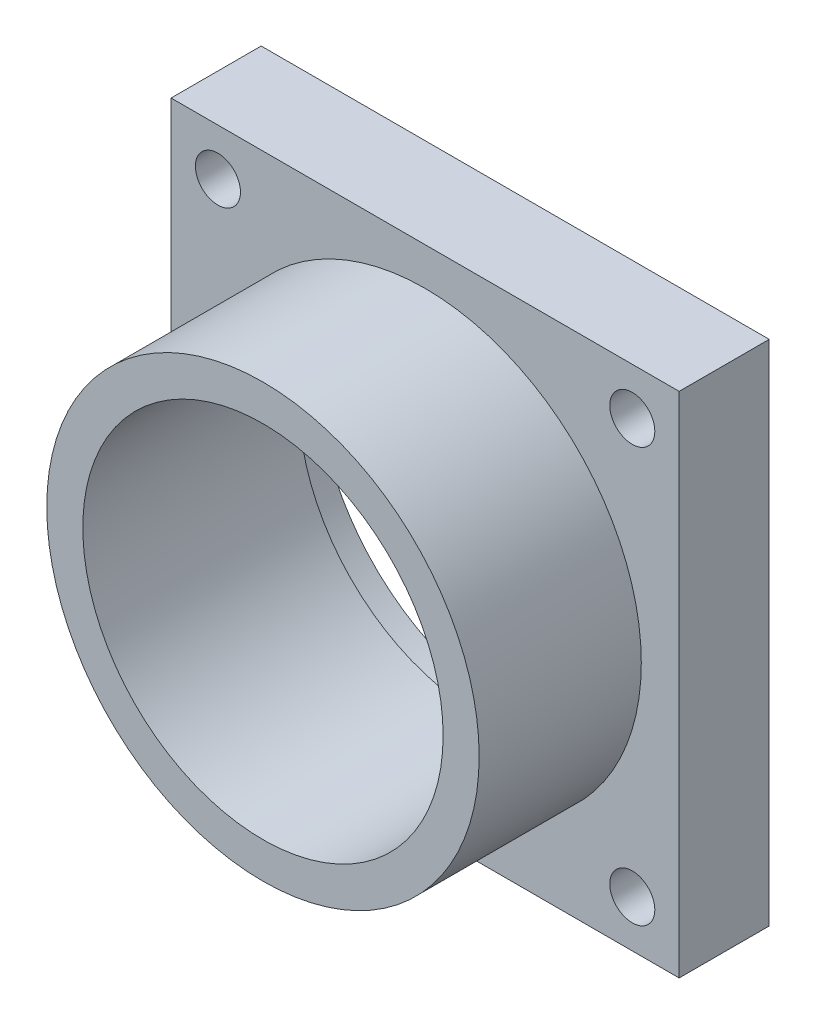
ISO-10303-21;
HEADER;
FILE_DESCRIPTION(('STEP AP214'),'2;1');
FILE_NAME('part.step','',(''),(''),'','','');
FILE_SCHEMA(('AUTOMOTIVE_DESIGN { 1 0 10303 214 1 1 1 1 }'));
ENDSEC;
DATA;
#1=APPLICATION_CONTEXT('core data for automotive mechanical design processes');
#2=APPLICATION_PROTOCOL_DEFINITION('international standard','automotive_design',2000,#1);
#3=PRODUCT_CONTEXT('',#1,'mechanical');
#4=PRODUCT('Part','Part','',(#3));
#5=PRODUCT_RELATED_PRODUCT_CATEGORY('part','',(#4));
#6=PRODUCT_DEFINITION_FORMATION('','',#4);
#7=PRODUCT_DEFINITION_CONTEXT('part definition',#1,'design');
#8=PRODUCT_DEFINITION('design','',#6,#7);
#9=PRODUCT_DEFINITION_SHAPE('','',#8);
#10=(LENGTH_UNIT() NAMED_UNIT(*) SI_UNIT(.MILLI.,.METRE.));
#11=(NAMED_UNIT(*) PLANE_ANGLE_UNIT() SI_UNIT($,.RADIAN.));
#12=(NAMED_UNIT(*) SI_UNIT($,.STERADIAN.) SOLID_ANGLE_UNIT());
#13=UNCERTAINTY_MEASURE_WITH_UNIT(LENGTH_MEASURE(1.E-05),#10,'distance_accuracy_value','');
#14=(GEOMETRIC_REPRESENTATION_CONTEXT(3) GLOBAL_UNCERTAINTY_ASSIGNED_CONTEXT((#13)) GLOBAL_UNIT_ASSIGNED_CONTEXT((#10,
#11,#12)) REPRESENTATION_CONTEXT('',''));
#15=CARTESIAN_POINT('',(0.,0.,0.));
#16=DIRECTION('',(0.,0.,1.));
#17=DIRECTION('',(1.,0.,0.));
#18=AXIS2_PLACEMENT_3D('',#15,#16,#17);
#19=CARTESIAN_POINT('',(14.1,0.,5.));
#20=DIRECTION('',(1.,0.,0.));
#21=DIRECTION('',(0.,0.,-1.));
#22=AXIS2_PLACEMENT_3D('',#19,#20,#21);
#23=PLANE('',#22);
#24=DIRECTION('',(0.,-1.,0.));
#25=VECTOR('',#24,1.);
#26=CARTESIAN_POINT('',(14.1,0.,0.));
#27=LINE('',#26,#25);
#28=CARTESIAN_POINT('',(14.1,14.1,0.));
#29=VERTEX_POINT('',#28);
#30=CARTESIAN_POINT('',(14.1,-14.1,0.));
#31=VERTEX_POINT('',#30);
#32=EDGE_CURVE('E130',#29,#31,#27,.T.);
#33=ORIENTED_EDGE('',*,*,#32,.F.);
#34=DIRECTION('',(0.,0.,-1.));
#35=VECTOR('',#34,1.);
#36=CARTESIAN_POINT('',(14.1,14.1,5.));
#37=LINE('',#36,#35);
#38=CARTESIAN_POINT('',(14.1,14.1,5.));
#39=VERTEX_POINT('',#38);
#40=EDGE_CURVE('E11',#39,#29,#37,.T.);
#41=ORIENTED_EDGE('',*,*,#40,.F.);
#42=DIRECTION('',(0.,-1.,0.));
#43=VECTOR('',#42,1.);
#44=CARTESIAN_POINT('',(14.1,0.,5.));
#45=LINE('',#44,#43);
#46=CARTESIAN_POINT('',(14.1,-14.1,5.));
#47=VERTEX_POINT('',#46);
#48=EDGE_CURVE('E103',#39,#47,#45,.T.);
#49=ORIENTED_EDGE('',*,*,#48,.T.);
#50=DIRECTION('',(0.,0.,-1.));
#51=VECTOR('',#50,1.);
#52=CARTESIAN_POINT('',(14.1,-14.1,5.));
#53=LINE('',#52,#51);
#54=EDGE_CURVE('E80',#47,#31,#53,.T.);
#55=ORIENTED_EDGE('',*,*,#54,.T.);
#56=EDGE_LOOP('',(#33,#41,#49,#55));
#57=FACE_BOUND('',#56,.T.);
#58=ADVANCED_FACE('F39',(#57),#23,.T.);
#59=CARTESIAN_POINT('',(0.,14.1,5.));
#60=DIRECTION('',(0.,1.,0.));
#61=DIRECTION('',(0.,0.,1.));
#62=AXIS2_PLACEMENT_3D('',#59,#60,#61);
#63=PLANE('',#62);
#64=DIRECTION('',(1.,0.,0.));
#65=VECTOR('',#64,1.);
#66=CARTESIAN_POINT('',(0.,14.1,0.));
#67=LINE('',#66,#65);
#68=CARTESIAN_POINT('',(-14.1,14.1,0.));
#69=VERTEX_POINT('',#68);
#70=EDGE_CURVE('E92',#69,#29,#67,.T.);
#71=ORIENTED_EDGE('',*,*,#70,.F.);
#72=DIRECTION('',(0.,0.,-1.));
#73=VECTOR('',#72,1.);
#74=CARTESIAN_POINT('',(-14.1,14.1,5.));
#75=LINE('',#74,#73);
#76=CARTESIAN_POINT('',(-14.1,14.1,5.));
#77=VERTEX_POINT('',#76);
#78=EDGE_CURVE('E49',#77,#69,#75,.T.);
#79=ORIENTED_EDGE('',*,*,#78,.F.);
#80=DIRECTION('',(1.,0.,0.));
#81=VECTOR('',#80,1.);
#82=CARTESIAN_POINT('',(0.,14.1,5.));
#83=LINE('',#82,#81);
#84=EDGE_CURVE('E90',#77,#39,#83,.T.);
#85=ORIENTED_EDGE('',*,*,#84,.T.);
#86=ORIENTED_EDGE('',*,*,#40,.T.);
#87=EDGE_LOOP('',(#71,#79,#85,#86));
#88=FACE_BOUND('',#87,.T.);
#89=ADVANCED_FACE('F88',(#88),#63,.T.);
#90=CARTESIAN_POINT('',(-14.1,0.,5.));
#91=DIRECTION('',(1.,0.,0.));
#92=DIRECTION('',(0.,0.,-1.));
#93=AXIS2_PLACEMENT_3D('',#90,#91,#92);
#94=PLANE('',#93);
#95=DIRECTION('',(0.,-1.,0.));
#96=VECTOR('',#95,1.);
#97=CARTESIAN_POINT('',(-14.1,0.,0.));
#98=LINE('',#97,#96);
#99=CARTESIAN_POINT('',(-14.1,-14.1,0.));
#100=VERTEX_POINT('',#99);
#101=EDGE_CURVE('E135',#69,#100,#98,.T.);
#102=ORIENTED_EDGE('',*,*,#101,.T.);
#103=DIRECTION('',(0.,0.,-1.));
#104=VECTOR('',#103,1.);
#105=CARTESIAN_POINT('',(-14.1,-14.1,5.));
#106=LINE('',#105,#104);
#107=CARTESIAN_POINT('',(-14.1,-14.1,5.));
#108=VERTEX_POINT('',#107);
#109=EDGE_CURVE('E96',#108,#100,#106,.T.);
#110=ORIENTED_EDGE('',*,*,#109,.F.);
#111=DIRECTION('',(0.,-1.,0.));
#112=VECTOR('',#111,1.);
#113=CARTESIAN_POINT('',(-14.1,0.,5.));
#114=LINE('',#113,#112);
#115=EDGE_CURVE('E98',#77,#108,#114,.T.);
#116=ORIENTED_EDGE('',*,*,#115,.F.);
#117=ORIENTED_EDGE('',*,*,#78,.T.);
#118=EDGE_LOOP('',(#102,#110,#116,#117));
#119=FACE_BOUND('',#118,.T.);
#120=ADVANCED_FACE('F99',(#119),#94,.F.);
#121=CARTESIAN_POINT('',(0.,-14.1,5.));
#122=DIRECTION('',(0.,1.,0.));
#123=DIRECTION('',(0.,0.,1.));
#124=AXIS2_PLACEMENT_3D('',#121,#122,#123);
#125=PLANE('',#124);
#126=DIRECTION('',(1.,0.,0.));
#127=VECTOR('',#126,1.);
#128=CARTESIAN_POINT('',(0.,-14.1,0.));
#129=LINE('',#128,#127);
#130=EDGE_CURVE('E73',#100,#31,#129,.T.);
#131=ORIENTED_EDGE('',*,*,#130,.T.);
#132=ORIENTED_EDGE('',*,*,#54,.F.);
#133=DIRECTION('',(1.,0.,0.));
#134=VECTOR('',#133,1.);
#135=CARTESIAN_POINT('',(0.,-14.1,5.));
#136=LINE('',#135,#134);
#137=EDGE_CURVE('E57',#108,#47,#136,.T.);
#138=ORIENTED_EDGE('',*,*,#137,.F.);
#139=ORIENTED_EDGE('',*,*,#109,.T.);
#140=EDGE_LOOP('',(#131,#132,#138,#139));
#141=FACE_BOUND('',#140,.T.);
#142=ADVANCED_FACE('F145',(#141),#125,.F.);
#143=CARTESIAN_POINT('',(-11.5,11.5,5.));
#144=DIRECTION('',(0.,0.,-1.));
#145=DIRECTION('',(-1.,0.,0.));
#146=AXIS2_PLACEMENT_3D('',#143,#144,#145);
#147=CYLINDRICAL_SURFACE('',#146,1.25);
#148=CARTESIAN_POINT('',(-11.5,11.5,5.));
#149=DIRECTION('',(0.,0.,1.));
#150=DIRECTION('',(1.,0.,0.));
#151=AXIS2_PLACEMENT_3D('',#148,#149,#150);
#152=CIRCLE('',#151,1.25);
#153=CARTESIAN_POINT('',(-10.25,11.5,5.));
#154=VERTEX_POINT('',#153);
#155=EDGE_CURVE('E107',#154,#154,#152,.T.);
#156=ORIENTED_EDGE('',*,*,#155,.T.);
#157=EDGE_LOOP('',(#156));
#158=FACE_BOUND('',#157,.T.);
#159=CARTESIAN_POINT('',(-11.5,11.5,0.));
#160=DIRECTION('',(0.,0.,1.));
#161=DIRECTION('',(1.,0.,0.));
#162=AXIS2_PLACEMENT_3D('',#159,#160,#161);
#163=CIRCLE('',#162,1.25);
#164=CARTESIAN_POINT('',(-10.25,11.5,0.));
#165=VERTEX_POINT('',#164);
#166=EDGE_CURVE('E126',#165,#165,#163,.T.);
#167=ORIENTED_EDGE('',*,*,#166,.F.);
#168=EDGE_LOOP('',(#167));
#169=FACE_BOUND('',#168,.T.);
#170=ADVANCED_FACE('F155',(#158,#169),#147,.F.);
#171=CARTESIAN_POINT('',(11.5000000000002,-11.5,5.));
#172=DIRECTION('',(0.,0.,-1.));
#173=DIRECTION('',(-1.,0.,0.));
#174=AXIS2_PLACEMENT_3D('',#171,#172,#173);
#175=CYLINDRICAL_SURFACE('',#174,1.25);
#176=CARTESIAN_POINT('',(11.5000000000002,-11.5,5.));
#177=DIRECTION('',(0.,0.,1.));
#178=DIRECTION('',(1.,0.,0.));
#179=AXIS2_PLACEMENT_3D('',#176,#177,#178);
#180=CIRCLE('',#179,1.25);
#181=CARTESIAN_POINT('',(12.7500000000002,-11.5,5.));
#182=VERTEX_POINT('',#181);
#183=EDGE_CURVE('E320',#182,#182,#180,.T.);
#184=ORIENTED_EDGE('',*,*,#183,.T.);
#185=EDGE_LOOP('',(#184));
#186=FACE_BOUND('',#185,.T.);
#187=CARTESIAN_POINT('',(11.5000000000002,-11.5,0.));
#188=DIRECTION('',(0.,0.,1.));
#189=DIRECTION('',(1.,0.,0.));
#190=AXIS2_PLACEMENT_3D('',#187,#188,#189);
#191=CIRCLE('',#190,1.25);
#192=CARTESIAN_POINT('',(12.7500000000002,-11.5,0.));
#193=VERTEX_POINT('',#192);
#194=EDGE_CURVE('E122',#193,#193,#191,.T.);
#195=ORIENTED_EDGE('',*,*,#194,.F.);
#196=EDGE_LOOP('',(#195));
#197=FACE_BOUND('',#196,.T.);
#198=ADVANCED_FACE('F158',(#186,#197),#175,.F.);
#199=CARTESIAN_POINT('',(-11.4999999999998,-11.5,5.));
#200=DIRECTION('',(0.,0.,-1.));
#201=DIRECTION('',(-1.,0.,0.));
#202=AXIS2_PLACEMENT_3D('',#199,#200,#201);
#203=CYLINDRICAL_SURFACE('',#202,1.25);
#204=CARTESIAN_POINT('',(-11.4999999999998,-11.5,5.));
#205=DIRECTION('',(0.,0.,1.));
#206=DIRECTION('',(1.,0.,0.));
#207=AXIS2_PLACEMENT_3D('',#204,#205,#206);
#208=CIRCLE('',#207,1.25);
#209=CARTESIAN_POINT('',(-10.2499999999998,-11.5,5.));
#210=VERTEX_POINT('',#209);
#211=EDGE_CURVE('E173',#210,#210,#208,.T.);
#212=ORIENTED_EDGE('',*,*,#211,.T.);
#213=EDGE_LOOP('',(#212));
#214=FACE_BOUND('',#213,.T.);
#215=CARTESIAN_POINT('',(-11.4999999999998,-11.5,0.));
#216=DIRECTION('',(0.,0.,1.));
#217=DIRECTION('',(1.,0.,0.));
#218=AXIS2_PLACEMENT_3D('',#215,#216,#217);
#219=CIRCLE('',#218,1.25);
#220=CARTESIAN_POINT('',(-10.2499999999998,-11.5,0.));
#221=VERTEX_POINT('',#220);
#222=EDGE_CURVE('E117',#221,#221,#219,.T.);
#223=ORIENTED_EDGE('',*,*,#222,.F.);
#224=EDGE_LOOP('',(#223));
#225=FACE_BOUND('',#224,.T.);
#226=ADVANCED_FACE('F161',(#214,#225),#203,.F.);
#227=CARTESIAN_POINT('',(11.5,11.5,5.));
#228=DIRECTION('',(0.,0.,-1.));
#229=DIRECTION('',(-1.,0.,0.));
#230=AXIS2_PLACEMENT_3D('',#227,#228,#229);
#231=CYLINDRICAL_SURFACE('',#230,1.25);
#232=CARTESIAN_POINT('',(11.5,11.5,5.));
#233=DIRECTION('',(0.,0.,1.));
#234=DIRECTION('',(1.,0.,0.));
#235=AXIS2_PLACEMENT_3D('',#232,#233,#234);
#236=CIRCLE('',#235,1.25);
#237=CARTESIAN_POINT('',(12.75,11.5,5.));
#238=VERTEX_POINT('',#237);
#239=EDGE_CURVE('E140',#238,#238,#236,.T.);
#240=ORIENTED_EDGE('',*,*,#239,.T.);
#241=EDGE_LOOP('',(#240));
#242=FACE_BOUND('',#241,.T.);
#243=CARTESIAN_POINT('',(11.5,11.5,0.));
#244=DIRECTION('',(0.,0.,1.));
#245=DIRECTION('',(1.,0.,0.));
#246=AXIS2_PLACEMENT_3D('',#243,#244,#245);
#247=CIRCLE('',#246,1.25);
#248=CARTESIAN_POINT('',(12.75,11.5,0.));
#249=VERTEX_POINT('',#248);
#250=EDGE_CURVE('E113',#249,#249,#247,.T.);
#251=ORIENTED_EDGE('',*,*,#250,.F.);
#252=EDGE_LOOP('',(#251));
#253=FACE_BOUND('',#252,.T.);
#254=ADVANCED_FACE('F41',(#242,#253),#231,.F.);
#255=CARTESIAN_POINT('',(0.,0.,5.));
#256=DIRECTION('',(0.,0.,-1.));
#257=DIRECTION('',(-1.,0.,0.));
#258=AXIS2_PLACEMENT_3D('',#255,#256,#257);
#259=CYLINDRICAL_SURFACE('',#258,10.);
#260=CARTESIAN_POINT('',(0.,0.,2.));
#261=DIRECTION('',(0.,0.,1.));
#262=DIRECTION('',(1.,0.,0.));
#263=AXIS2_PLACEMENT_3D('',#260,#261,#262);
#264=CIRCLE('',#263,10.);
#265=CARTESIAN_POINT('',(10.,0.,2.));
#266=VERTEX_POINT('',#265);
#267=EDGE_CURVE('E292',#266,#266,#264,.T.);
#268=ORIENTED_EDGE('',*,*,#267,.F.);
#269=EDGE_LOOP('',(#268));
#270=FACE_BOUND('',#269,.T.);
#271=CARTESIAN_POINT('',(0.,0.,14.));
#272=DIRECTION('',(0.,0.,1.));
#273=DIRECTION('',(1.,0.,0.));
#274=AXIS2_PLACEMENT_3D('',#271,#272,#273);
#275=CIRCLE('',#274,10.);
#276=CARTESIAN_POINT('',(10.,0.,14.));
#277=VERTEX_POINT('',#276);
#278=EDGE_CURVE('E297',#277,#277,#275,.T.);
#279=ORIENTED_EDGE('',*,*,#278,.T.);
#280=EDGE_LOOP('',(#279));
#281=FACE_BOUND('',#280,.T.);
#282=ADVANCED_FACE('F168',(#270,#281),#259,.F.);
#283=CARTESIAN_POINT('',(0.,0.,5.));
#284=DIRECTION('',(0.,0.,1.));
#285=DIRECTION('',(1.,0.,0.));
#286=AXIS2_PLACEMENT_3D('',#283,#284,#285);
#287=PLANE('',#286);
#288=CARTESIAN_POINT('',(0.,0.,5.));
#289=DIRECTION('',(0.,0.,1.));
#290=DIRECTION('',(1.,0.,0.));
#291=AXIS2_PLACEMENT_3D('',#288,#289,#290);
#292=CIRCLE('',#291,12.);
#293=CARTESIAN_POINT('',(12.,0.,5.));
#294=VERTEX_POINT('',#293);
#295=EDGE_CURVE('E118',#294,#294,#292,.F.);
#296=ORIENTED_EDGE('',*,*,#295,.T.);
#297=EDGE_LOOP('',(#296));
#298=FACE_BOUND('',#297,.T.);
#299=ORIENTED_EDGE('',*,*,#239,.F.);
#300=EDGE_LOOP('',(#299));
#301=FACE_BOUND('',#300,.T.);
#302=ORIENTED_EDGE('',*,*,#211,.F.);
#303=EDGE_LOOP('',(#302));
#304=FACE_BOUND('',#303,.T.);
#305=ORIENTED_EDGE('',*,*,#183,.F.);
#306=EDGE_LOOP('',(#305));
#307=FACE_BOUND('',#306,.T.);
#308=ORIENTED_EDGE('',*,*,#155,.F.);
#309=EDGE_LOOP('',(#308));
#310=FACE_BOUND('',#309,.T.);
#311=ORIENTED_EDGE('',*,*,#48,.F.);
#312=ORIENTED_EDGE('',*,*,#84,.F.);
#313=ORIENTED_EDGE('',*,*,#115,.T.);
#314=ORIENTED_EDGE('',*,*,#137,.T.);
#315=EDGE_LOOP('',(#311,#312,#313,#314));
#316=FACE_BOUND('',#315,.T.);
#317=ADVANCED_FACE('F102',(#298,#301,#304,#307,#310,#316),#287,.T.);
#318=CARTESIAN_POINT('',(0.,0.,0.));
#319=DIRECTION('',(0.,0.,1.));
#320=DIRECTION('',(1.,0.,0.));
#321=AXIS2_PLACEMENT_3D('',#318,#319,#320);
#322=PLANE('',#321);
#323=CARTESIAN_POINT('',(0.,0.,0.));
#324=DIRECTION('',(0.,0.,1.));
#325=DIRECTION('',(1.,0.,0.));
#326=AXIS2_PLACEMENT_3D('',#323,#324,#325);
#327=CIRCLE('',#326,11.);
#328=CARTESIAN_POINT('',(11.,0.,0.));
#329=VERTEX_POINT('',#328);
#330=EDGE_CURVE('E304',#329,#329,#327,.T.);
#331=ORIENTED_EDGE('',*,*,#330,.T.);
#332=EDGE_LOOP('',(#331));
#333=FACE_BOUND('',#332,.T.);
#334=ORIENTED_EDGE('',*,*,#250,.T.);
#335=EDGE_LOOP('',(#334));
#336=FACE_BOUND('',#335,.T.);
#337=ORIENTED_EDGE('',*,*,#222,.T.);
#338=EDGE_LOOP('',(#337));
#339=FACE_BOUND('',#338,.T.);
#340=ORIENTED_EDGE('',*,*,#194,.T.);
#341=EDGE_LOOP('',(#340));
#342=FACE_BOUND('',#341,.T.);
#343=ORIENTED_EDGE('',*,*,#166,.T.);
#344=EDGE_LOOP('',(#343));
#345=FACE_BOUND('',#344,.T.);
#346=ORIENTED_EDGE('',*,*,#32,.T.);
#347=ORIENTED_EDGE('',*,*,#130,.F.);
#348=ORIENTED_EDGE('',*,*,#101,.F.);
#349=ORIENTED_EDGE('',*,*,#70,.T.);
#350=EDGE_LOOP('',(#346,#347,#348,#349));
#351=FACE_BOUND('',#350,.T.);
#352=ADVANCED_FACE('F146',(#333,#336,#339,#342,#345,#351),#322,.F.);
#353=CARTESIAN_POINT('',(0.,0.,14.));
#354=DIRECTION('',(0.,0.,-1.));
#355=DIRECTION('',(-1.,0.,0.));
#356=AXIS2_PLACEMENT_3D('',#353,#354,#355);
#357=CYLINDRICAL_SURFACE('',#356,12.);
#358=ORIENTED_EDGE('',*,*,#295,.F.);
#359=EDGE_LOOP('',(#358));
#360=FACE_BOUND('',#359,.T.);
#361=CARTESIAN_POINT('',(0.,0.,14.));
#362=DIRECTION('',(0.,0.,1.));
#363=DIRECTION('',(1.,0.,0.));
#364=AXIS2_PLACEMENT_3D('',#361,#362,#363);
#365=CIRCLE('',#364,12.);
#366=CARTESIAN_POINT('',(12.,0.,14.));
#367=VERTEX_POINT('',#366);
#368=EDGE_CURVE('E302',#367,#367,#365,.T.);
#369=ORIENTED_EDGE('',*,*,#368,.F.);
#370=EDGE_LOOP('',(#369));
#371=FACE_BOUND('',#370,.T.);
#372=ADVANCED_FACE('F178',(#360,#371),#357,.T.);
#373=CARTESIAN_POINT('',(0.,0.,14.));
#374=DIRECTION('',(0.,0.,1.));
#375=DIRECTION('',(1.,0.,0.));
#376=AXIS2_PLACEMENT_3D('',#373,#374,#375);
#377=PLANE('',#376);
#378=ORIENTED_EDGE('',*,*,#278,.F.);
#379=EDGE_LOOP('',(#378));
#380=FACE_BOUND('',#379,.T.);
#381=ORIENTED_EDGE('',*,*,#368,.T.);
#382=EDGE_LOOP('',(#381));
#383=FACE_BOUND('',#382,.T.);
#384=ADVANCED_FACE('F190',(#380,#383),#377,.T.);
#385=CARTESIAN_POINT('',(0.,0.,2.));
#386=DIRECTION('',(0.,0.,-1.));
#387=DIRECTION('',(-1.,0.,0.));
#388=AXIS2_PLACEMENT_3D('',#385,#386,#387);
#389=CYLINDRICAL_SURFACE('',#388,11.);
#390=CARTESIAN_POINT('',(0.,0.,2.));
#391=DIRECTION('',(0.,0.,1.));
#392=DIRECTION('',(1.,0.,0.));
#393=AXIS2_PLACEMENT_3D('',#390,#391,#392);
#394=CIRCLE('',#393,11.);
#395=CARTESIAN_POINT('',(11.,0.,2.));
#396=VERTEX_POINT('',#395);
#397=EDGE_CURVE('E295',#396,#396,#394,.T.);
#398=ORIENTED_EDGE('',*,*,#397,.T.);
#399=EDGE_LOOP('',(#398));
#400=FACE_BOUND('',#399,.T.);
#401=ORIENTED_EDGE('',*,*,#330,.F.);
#402=EDGE_LOOP('',(#401));
#403=FACE_BOUND('',#402,.T.);
#404=ADVANCED_FACE('F255',(#400,#403),#389,.F.);
#405=CARTESIAN_POINT('',(0.,0.,2.));
#406=DIRECTION('',(0.,0.,1.));
#407=DIRECTION('',(1.,0.,0.));
#408=AXIS2_PLACEMENT_3D('',#405,#406,#407);
#409=PLANE('',#408);
#410=ORIENTED_EDGE('',*,*,#267,.T.);
#411=EDGE_LOOP('',(#410));
#412=FACE_BOUND('',#411,.T.);
#413=ORIENTED_EDGE('',*,*,#397,.F.);
#414=EDGE_LOOP('',(#413));
#415=FACE_BOUND('',#414,.T.);
#416=ADVANCED_FACE('F275',(#412,#415),#409,.F.);
#417=CLOSED_SHELL('',(#58,#89,#120,#142,#170,#198,#226,#254,#282,#317,#352,#372,#384,#404,#416));
#418=MANIFOLD_SOLID_BREP('B2',#417);
#419=ADVANCED_BREP_SHAPE_REPRESENTATION('',(#18,#418),#14);
#420=SHAPE_DEFINITION_REPRESENTATION(#9,#419);
ENDSEC;
END-ISO-10303-21;
